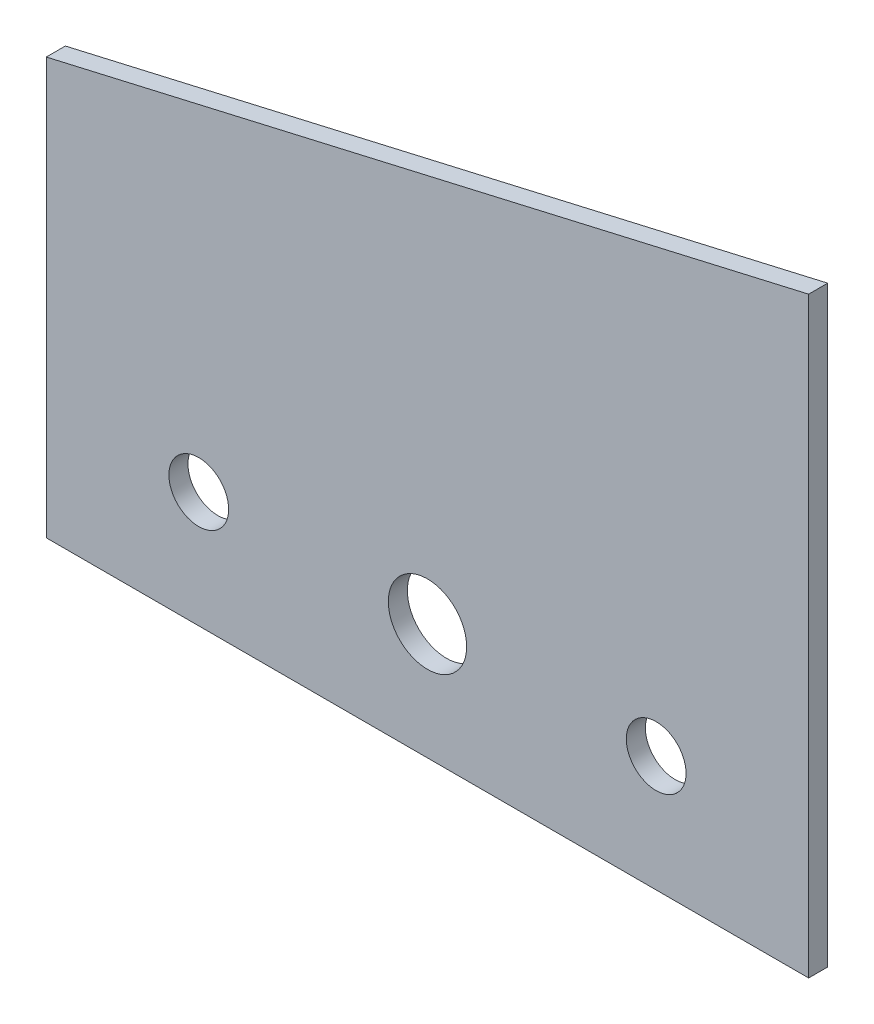
ISO-10303-21;
HEADER;
FILE_DESCRIPTION(('STEP AP214'),'2;1');
FILE_NAME('part.step','',(''),(''),'','','');
FILE_SCHEMA(('AUTOMOTIVE_DESIGN { 1 0 10303 214 1 1 1 1 }'));
ENDSEC;
DATA;
#1=APPLICATION_CONTEXT('core data for automotive mechanical design processes');
#2=APPLICATION_PROTOCOL_DEFINITION('international standard','automotive_design',2000,#1);
#3=PRODUCT_CONTEXT('',#1,'mechanical');
#4=PRODUCT('Part','Part','',(#3));
#5=PRODUCT_RELATED_PRODUCT_CATEGORY('part','',(#4));
#6=PRODUCT_DEFINITION_FORMATION('','',#4);
#7=PRODUCT_DEFINITION_CONTEXT('part definition',#1,'design');
#8=PRODUCT_DEFINITION('design','',#6,#7);
#9=PRODUCT_DEFINITION_SHAPE('','',#8);
#10=(LENGTH_UNIT() NAMED_UNIT(*) SI_UNIT(.MILLI.,.METRE.));
#11=(NAMED_UNIT(*) PLANE_ANGLE_UNIT() SI_UNIT($,.RADIAN.));
#12=(NAMED_UNIT(*) SI_UNIT($,.STERADIAN.) SOLID_ANGLE_UNIT());
#13=UNCERTAINTY_MEASURE_WITH_UNIT(LENGTH_MEASURE(1.E-05),#10,'distance_accuracy_value','');
#14=(GEOMETRIC_REPRESENTATION_CONTEXT(3) GLOBAL_UNCERTAINTY_ASSIGNED_CONTEXT((#13)) GLOBAL_UNIT_ASSIGNED_CONTEXT((#10,
#11,#12)) REPRESENTATION_CONTEXT('',''));
#15=CARTESIAN_POINT('',(0.,0.,0.));
#16=DIRECTION('',(0.,0.,1.));
#17=DIRECTION('',(1.,0.,0.));
#18=AXIS2_PLACEMENT_3D('',#15,#16,#17);
#19=CARTESIAN_POINT('',(0.,0.,1.5875));
#20=DIRECTION('',(0.,0.,-1.));
#21=DIRECTION('',(-1.,0.,0.));
#22=AXIS2_PLACEMENT_3D('',#19,#20,#21);
#23=PLANE('',#22);
#24=DIRECTION('',(1.,0.,0.));
#25=VECTOR('',#24,1.);
#26=CARTESIAN_POINT('',(1385.52228846327,-118.313538862968,1.5875));
#27=LINE('',#26,#25);
#28=CARTESIAN_POINT('',(1322.02228846327,-118.313538862968,1.5875));
#29=VERTEX_POINT('',#28);
#30=CARTESIAN_POINT('',(1385.52228846327,-118.313538862968,1.5875));
#31=VERTEX_POINT('',#30);
#32=EDGE_CURVE('E91',#29,#31,#27,.T.);
#33=ORIENTED_EDGE('',*,*,#32,.T.);
#34=DIRECTION('',(0.,1.,0.));
#35=VECTOR('',#34,1.);
#36=CARTESIAN_POINT('',(1385.52228846327,-68.9841988629678,1.5875));
#37=LINE('',#36,#35);
#38=CARTESIAN_POINT('',(1385.52228846327,-68.9841988629678,1.5875));
#39=VERTEX_POINT('',#38);
#40=EDGE_CURVE('E86',#31,#39,#37,.T.);
#41=ORIENTED_EDGE('',*,*,#40,.T.);
#42=DIRECTION('',(-0.974426814238576,-0.224705103842479,0.));
#43=VECTOR('',#42,1.);
#44=CARTESIAN_POINT('',(1322.02228846327,-83.6274474738419,1.5875));
#45=LINE('',#44,#43);
#46=CARTESIAN_POINT('',(1322.02228846327,-83.6274474738419,1.5875));
#47=VERTEX_POINT('',#46);
#48=EDGE_CURVE('E89',#39,#47,#45,.T.);
#49=ORIENTED_EDGE('',*,*,#48,.T.);
#50=DIRECTION('',(0.,-1.,0.));
#51=VECTOR('',#50,1.);
#52=CARTESIAN_POINT('',(1322.02228846327,-118.313538862968,1.5875));
#53=LINE('',#52,#51);
#54=EDGE_CURVE('E56',#47,#29,#53,.T.);
#55=ORIENTED_EDGE('',*,*,#54,.T.);
#56=EDGE_LOOP('',(#33,#41,#49,#55));
#57=FACE_BOUND('',#56,.T.);
#58=CARTESIAN_POINT('',(1334.72228846327,-108.661538862968,1.5875));
#59=DIRECTION('',(0.,0.,1.));
#60=DIRECTION('',(1.,0.,0.));
#61=AXIS2_PLACEMENT_3D('',#58,#59,#60);
#62=CIRCLE('',#61,2.48920000000017);
#63=CARTESIAN_POINT('',(1337.21148846327,-108.661538862968,1.5875));
#64=VERTEX_POINT('',#63);
#65=EDGE_CURVE('E106',#64,#64,#62,.T.);
#66=ORIENTED_EDGE('',*,*,#65,.F.);
#67=EDGE_LOOP('',(#66));
#68=FACE_BOUND('',#67,.T.);
#69=CARTESIAN_POINT('',(1372.82228846327,-108.661538862968,1.5875));
#70=DIRECTION('',(0.,0.,1.));
#71=DIRECTION('',(1.,0.,0.));
#72=AXIS2_PLACEMENT_3D('',#69,#70,#71);
#73=CIRCLE('',#72,2.48920000000017);
#74=CARTESIAN_POINT('',(1375.31148846327,-108.661538862968,1.5875));
#75=VERTEX_POINT('',#74);
#76=EDGE_CURVE('E121',#75,#75,#73,.T.);
#77=ORIENTED_EDGE('',*,*,#76,.F.);
#78=EDGE_LOOP('',(#77));
#79=FACE_BOUND('',#78,.T.);
#80=CARTESIAN_POINT('',(1353.77228846327,-108.661538862968,1.5875));
#81=DIRECTION('',(0.,0.,1.));
#82=DIRECTION('',(1.,0.,0.));
#83=AXIS2_PLACEMENT_3D('',#80,#81,#82);
#84=CIRCLE('',#83,3.26390000000012);
#85=CARTESIAN_POINT('',(1357.03618846327,-108.661538862968,1.5875));
#86=VERTEX_POINT('',#85);
#87=EDGE_CURVE('E127',#86,#86,#84,.T.);
#88=ORIENTED_EDGE('',*,*,#87,.F.);
#89=EDGE_LOOP('',(#88));
#90=FACE_BOUND('',#89,.T.);
#91=ADVANCED_FACE('F39',(#57,#68,#79,#90),#23,.F.);
#92=CARTESIAN_POINT('',(0.,0.,0.));
#93=DIRECTION('',(0.,0.,-1.));
#94=DIRECTION('',(-1.,0.,0.));
#95=AXIS2_PLACEMENT_3D('',#92,#93,#94);
#96=PLANE('',#95);
#97=CARTESIAN_POINT('',(1372.82228846327,-108.661538862968,0.));
#98=DIRECTION('',(0.,0.,1.));
#99=DIRECTION('',(1.,0.,0.));
#100=AXIS2_PLACEMENT_3D('',#97,#98,#99);
#101=CIRCLE('',#100,2.48920000000017);
#102=CARTESIAN_POINT('',(1375.31148846327,-108.661538862968,0.));
#103=VERTEX_POINT('',#102);
#104=EDGE_CURVE('E124',#103,#103,#101,.T.);
#105=ORIENTED_EDGE('',*,*,#104,.T.);
#106=EDGE_LOOP('',(#105));
#107=FACE_BOUND('',#106,.T.);
#108=DIRECTION('',(1.,0.,0.));
#109=VECTOR('',#108,1.);
#110=CARTESIAN_POINT('',(1385.52228846327,-118.313538862968,0.));
#111=LINE('',#110,#109);
#112=CARTESIAN_POINT('',(1322.02228846327,-118.313538862968,0.));
#113=VERTEX_POINT('',#112);
#114=CARTESIAN_POINT('',(1385.52228846327,-118.313538862968,0.));
#115=VERTEX_POINT('',#114);
#116=EDGE_CURVE('E103',#113,#115,#111,.T.);
#117=ORIENTED_EDGE('',*,*,#116,.F.);
#118=DIRECTION('',(0.,-1.,0.));
#119=VECTOR('',#118,1.);
#120=CARTESIAN_POINT('',(1322.02228846327,-118.313538862968,0.));
#121=LINE('',#120,#119);
#122=CARTESIAN_POINT('',(1322.02228846327,-83.6274474738419,0.));
#123=VERTEX_POINT('',#122);
#124=EDGE_CURVE('E79',#123,#113,#121,.T.);
#125=ORIENTED_EDGE('',*,*,#124,.F.);
#126=DIRECTION('',(-0.974426814238576,-0.224705103842479,0.));
#127=VECTOR('',#126,1.);
#128=CARTESIAN_POINT('',(1322.02228846327,-83.6274474738419,0.));
#129=LINE('',#128,#127);
#130=CARTESIAN_POINT('',(1385.52228846327,-68.9841988629678,0.));
#131=VERTEX_POINT('',#130);
#132=EDGE_CURVE('E73',#131,#123,#129,.T.);
#133=ORIENTED_EDGE('',*,*,#132,.F.);
#134=DIRECTION('',(0.,1.,0.));
#135=VECTOR('',#134,1.);
#136=CARTESIAN_POINT('',(1385.52228846327,-68.9841988629678,0.));
#137=LINE('',#136,#135);
#138=EDGE_CURVE('E95',#115,#131,#137,.T.);
#139=ORIENTED_EDGE('',*,*,#138,.F.);
#140=EDGE_LOOP('',(#117,#125,#133,#139));
#141=FACE_BOUND('',#140,.T.);
#142=CARTESIAN_POINT('',(1334.72228846327,-108.661538862968,0.));
#143=DIRECTION('',(0.,0.,1.));
#144=DIRECTION('',(1.,0.,0.));
#145=AXIS2_PLACEMENT_3D('',#142,#143,#144);
#146=CIRCLE('',#145,2.48920000000017);
#147=CARTESIAN_POINT('',(1337.21148846327,-108.661538862968,0.));
#148=VERTEX_POINT('',#147);
#149=EDGE_CURVE('E118',#148,#148,#146,.T.);
#150=ORIENTED_EDGE('',*,*,#149,.T.);
#151=EDGE_LOOP('',(#150));
#152=FACE_BOUND('',#151,.T.);
#153=CARTESIAN_POINT('',(1353.77228846327,-108.661538862968,0.));
#154=DIRECTION('',(0.,0.,1.));
#155=DIRECTION('',(1.,0.,0.));
#156=AXIS2_PLACEMENT_3D('',#153,#154,#155);
#157=CIRCLE('',#156,3.26390000000012);
#158=CARTESIAN_POINT('',(1357.03618846327,-108.661538862968,0.));
#159=VERTEX_POINT('',#158);
#160=EDGE_CURVE('E130',#159,#159,#157,.T.);
#161=ORIENTED_EDGE('',*,*,#160,.T.);
#162=EDGE_LOOP('',(#161));
#163=FACE_BOUND('',#162,.T.);
#164=ADVANCED_FACE('F114',(#107,#141,#152,#163),#96,.T.);
#165=CARTESIAN_POINT('',(1385.52228846327,-118.313538862968,1.5875));
#166=DIRECTION('',(0.,1.,0.));
#167=DIRECTION('',(-1.,0.,0.));
#168=AXIS2_PLACEMENT_3D('',#165,#166,#167);
#169=PLANE('',#168);
#170=ORIENTED_EDGE('',*,*,#116,.T.);
#171=DIRECTION('',(0.,0.,-1.));
#172=VECTOR('',#171,1.);
#173=CARTESIAN_POINT('',(1385.52228846327,-118.313538862968,1.5875));
#174=LINE('',#173,#172);
#175=EDGE_CURVE('E11',#31,#115,#174,.T.);
#176=ORIENTED_EDGE('',*,*,#175,.F.);
#177=ORIENTED_EDGE('',*,*,#32,.F.);
#178=DIRECTION('',(0.,0.,-1.));
#179=VECTOR('',#178,1.);
#180=CARTESIAN_POINT('',(1322.02228846327,-118.313538862968,1.5875));
#181=LINE('',#180,#179);
#182=EDGE_CURVE('E99',#29,#113,#181,.T.);
#183=ORIENTED_EDGE('',*,*,#182,.T.);
#184=EDGE_LOOP('',(#170,#176,#177,#183));
#185=FACE_BOUND('',#184,.T.);
#186=ADVANCED_FACE('F41',(#185),#169,.F.);
#187=CARTESIAN_POINT('',(1385.52228846327,-68.9841988629678,1.5875));
#188=DIRECTION('',(-1.,0.,0.));
#189=DIRECTION('',(0.,-1.,0.));
#190=AXIS2_PLACEMENT_3D('',#187,#188,#189);
#191=PLANE('',#190);
#192=ORIENTED_EDGE('',*,*,#138,.T.);
#193=DIRECTION('',(0.,0.,-1.));
#194=VECTOR('',#193,1.);
#195=CARTESIAN_POINT('',(1385.52228846327,-68.9841988629678,1.5875));
#196=LINE('',#195,#194);
#197=EDGE_CURVE('E48',#39,#131,#196,.T.);
#198=ORIENTED_EDGE('',*,*,#197,.F.);
#199=ORIENTED_EDGE('',*,*,#40,.F.);
#200=ORIENTED_EDGE('',*,*,#175,.T.);
#201=EDGE_LOOP('',(#192,#198,#199,#200));
#202=FACE_BOUND('',#201,.T.);
#203=ADVANCED_FACE('F94',(#202),#191,.F.);
#204=CARTESIAN_POINT('',(1322.02228846327,-83.6274474738419,1.5875));
#205=DIRECTION('',(0.224705103842479,-0.974426814238576,0.));
#206=DIRECTION('',(0.974426814238576,0.224705103842479,0.));
#207=AXIS2_PLACEMENT_3D('',#204,#205,#206);
#208=PLANE('',#207);
#209=ORIENTED_EDGE('',*,*,#132,.T.);
#210=DIRECTION('',(0.,0.,-1.));
#211=VECTOR('',#210,1.);
#212=CARTESIAN_POINT('',(1322.02228846327,-83.6274474738419,1.5875));
#213=LINE('',#212,#211);
#214=EDGE_CURVE('E96',#47,#123,#213,.T.);
#215=ORIENTED_EDGE('',*,*,#214,.F.);
#216=ORIENTED_EDGE('',*,*,#48,.F.);
#217=ORIENTED_EDGE('',*,*,#197,.T.);
#218=EDGE_LOOP('',(#209,#215,#216,#217));
#219=FACE_BOUND('',#218,.T.);
#220=ADVANCED_FACE('F97',(#219),#208,.F.);
#221=CARTESIAN_POINT('',(1322.02228846327,-118.313538862968,1.5875));
#222=DIRECTION('',(1.,0.,0.));
#223=DIRECTION('',(0.,0.,-1.));
#224=AXIS2_PLACEMENT_3D('',#221,#222,#223);
#225=PLANE('',#224);
#226=ORIENTED_EDGE('',*,*,#124,.T.);
#227=ORIENTED_EDGE('',*,*,#182,.F.);
#228=ORIENTED_EDGE('',*,*,#54,.F.);
#229=ORIENTED_EDGE('',*,*,#214,.T.);
#230=EDGE_LOOP('',(#226,#227,#228,#229));
#231=FACE_BOUND('',#230,.T.);
#232=ADVANCED_FACE('F111',(#231),#225,.F.);
#233=CARTESIAN_POINT('',(1334.72228846327,-108.661538862968,1.5875));
#234=DIRECTION('',(0.,0.,-1.));
#235=DIRECTION('',(-1.,0.,0.));
#236=AXIS2_PLACEMENT_3D('',#233,#234,#235);
#237=CYLINDRICAL_SURFACE('',#236,2.48920000000017);
#238=ORIENTED_EDGE('',*,*,#65,.T.);
#239=EDGE_LOOP('',(#238));
#240=FACE_BOUND('',#239,.T.);
#241=ORIENTED_EDGE('',*,*,#149,.F.);
#242=EDGE_LOOP('',(#241));
#243=FACE_BOUND('',#242,.T.);
#244=ADVANCED_FACE('F147',(#240,#243),#237,.F.);
#245=CARTESIAN_POINT('',(1372.82228846327,-108.661538862968,1.5875));
#246=DIRECTION('',(0.,0.,-1.));
#247=DIRECTION('',(-1.,0.,0.));
#248=AXIS2_PLACEMENT_3D('',#245,#246,#247);
#249=CYLINDRICAL_SURFACE('',#248,2.48920000000017);
#250=ORIENTED_EDGE('',*,*,#76,.T.);
#251=EDGE_LOOP('',(#250));
#252=FACE_BOUND('',#251,.T.);
#253=ORIENTED_EDGE('',*,*,#104,.F.);
#254=EDGE_LOOP('',(#253));
#255=FACE_BOUND('',#254,.T.);
#256=ADVANCED_FACE('F192',(#252,#255),#249,.F.);
#257=CARTESIAN_POINT('',(1353.77228846327,-108.661538862968,1.5875));
#258=DIRECTION('',(0.,0.,-1.));
#259=DIRECTION('',(-1.,0.,0.));
#260=AXIS2_PLACEMENT_3D('',#257,#258,#259);
#261=CYLINDRICAL_SURFACE('',#260,3.26390000000012);
#262=ORIENTED_EDGE('',*,*,#87,.T.);
#263=EDGE_LOOP('',(#262));
#264=FACE_BOUND('',#263,.T.);
#265=ORIENTED_EDGE('',*,*,#160,.F.);
#266=EDGE_LOOP('',(#265));
#267=FACE_BOUND('',#266,.T.);
#268=ADVANCED_FACE('F136',(#264,#267),#261,.F.);
#269=CLOSED_SHELL('',(#91,#164,#186,#203,#220,#232,#244,#256,#268));
#270=MANIFOLD_SOLID_BREP('B2',#269);
#271=ADVANCED_BREP_SHAPE_REPRESENTATION('',(#18,#270),#14);
#272=SHAPE_DEFINITION_REPRESENTATION(#9,#271);
ENDSEC;
END-ISO-10303-21;
